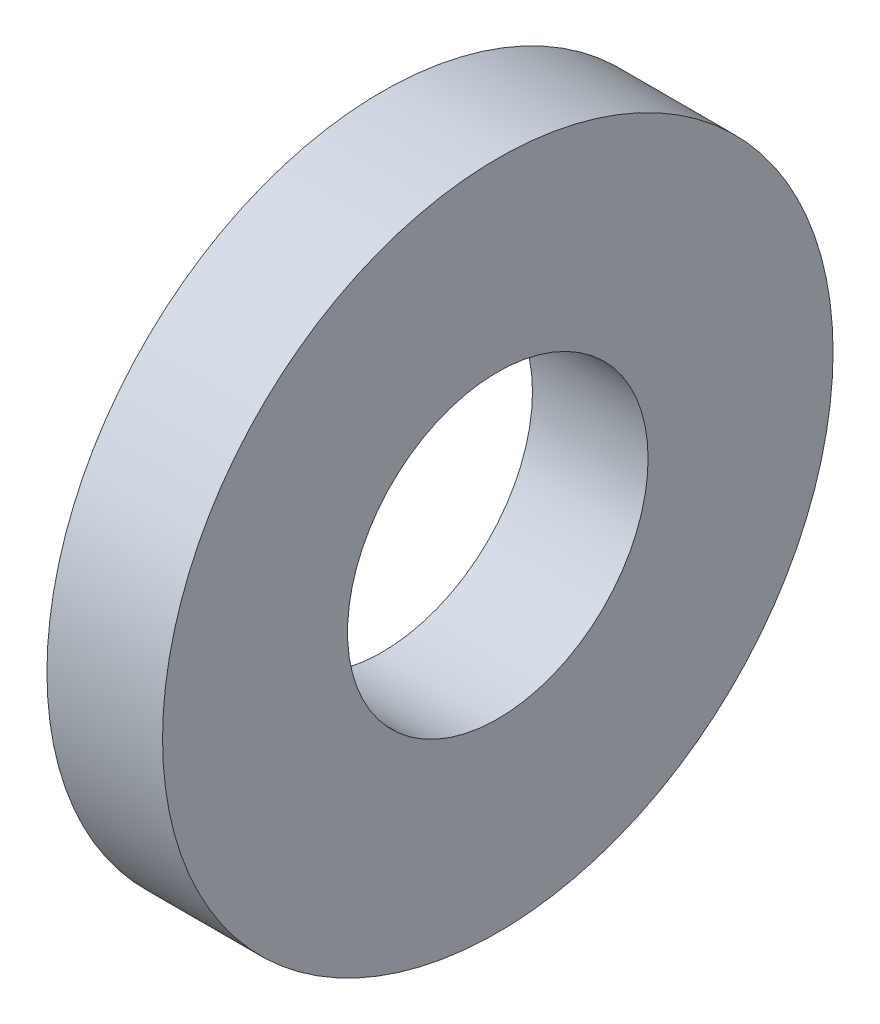
ISO-10303-21;
HEADER;
FILE_DESCRIPTION(('STEP AP214'),'2;1');
FILE_NAME('part.step','',(''),(''),'','','');
FILE_SCHEMA(('AUTOMOTIVE_DESIGN { 1 0 10303 214 1 1 1 1 }'));
ENDSEC;
DATA;
#1=APPLICATION_CONTEXT('core data for automotive mechanical design processes');
#2=APPLICATION_PROTOCOL_DEFINITION('international standard','automotive_design',2000,#1);
#3=PRODUCT_CONTEXT('',#1,'mechanical');
#4=PRODUCT('Part','Part','',(#3));
#5=PRODUCT_RELATED_PRODUCT_CATEGORY('part','',(#4));
#6=PRODUCT_DEFINITION_FORMATION('','',#4);
#7=PRODUCT_DEFINITION_CONTEXT('part definition',#1,'design');
#8=PRODUCT_DEFINITION('design','',#6,#7);
#9=PRODUCT_DEFINITION_SHAPE('','',#8);
#10=(LENGTH_UNIT() NAMED_UNIT(*) SI_UNIT(.MILLI.,.METRE.));
#11=(NAMED_UNIT(*) PLANE_ANGLE_UNIT() SI_UNIT($,.RADIAN.));
#12=(NAMED_UNIT(*) SI_UNIT($,.STERADIAN.) SOLID_ANGLE_UNIT());
#13=UNCERTAINTY_MEASURE_WITH_UNIT(LENGTH_MEASURE(1.E-05),#10,'distance_accuracy_value','');
#14=(GEOMETRIC_REPRESENTATION_CONTEXT(3) GLOBAL_UNCERTAINTY_ASSIGNED_CONTEXT((#13)) GLOBAL_UNIT_ASSIGNED_CONTEXT((#10,
#11,#12)) REPRESENTATION_CONTEXT('',''));
#15=CARTESIAN_POINT('',(0.,0.,0.));
#16=DIRECTION('',(0.,0.,1.));
#17=DIRECTION('',(1.,0.,0.));
#18=AXIS2_PLACEMENT_3D('',#15,#16,#17);
#19=CARTESIAN_POINT('',(1.25,0.,0.));
#20=DIRECTION('',(1.,0.,0.));
#21=DIRECTION('',(0.,0.,-1.));
#22=AXIS2_PLACEMENT_3D('',#19,#20,#21);
#23=PLANE('',#22);
#24=CARTESIAN_POINT('',(1.25,0.,0.));
#25=DIRECTION('',(1.,0.,0.));
#26=DIRECTION('',(0.,0.,-1.));
#27=AXIS2_PLACEMENT_3D('',#24,#25,#26);
#28=CIRCLE('',#27,7.25);
#29=CARTESIAN_POINT('',(1.25,0.,-7.25));
#30=VERTEX_POINT('',#29);
#31=EDGE_CURVE('E10',#30,#30,#28,.T.);
#32=ORIENTED_EDGE('',*,*,#31,.T.);
#33=EDGE_LOOP('',(#32));
#34=FACE_BOUND('',#33,.T.);
#35=CARTESIAN_POINT('',(1.25,0.,0.));
#36=DIRECTION('',(1.,0.,0.));
#37=DIRECTION('',(0.,0.,-1.));
#38=AXIS2_PLACEMENT_3D('',#35,#36,#37);
#39=CIRCLE('',#38,3.25);
#40=CARTESIAN_POINT('',(1.25,0.,-3.25));
#41=VERTEX_POINT('',#40);
#42=EDGE_CURVE('E42',#41,#41,#39,.T.);
#43=ORIENTED_EDGE('',*,*,#42,.F.);
#44=EDGE_LOOP('',(#43));
#45=FACE_BOUND('',#44,.T.);
#46=ADVANCED_FACE('F31',(#34,#45),#23,.T.);
#47=CARTESIAN_POINT('',(-1.25,0.,0.));
#48=DIRECTION('',(1.,0.,0.));
#49=DIRECTION('',(0.,0.,-1.));
#50=AXIS2_PLACEMENT_3D('',#47,#48,#49);
#51=PLANE('',#50);
#52=CARTESIAN_POINT('',(-1.25,0.,0.));
#53=DIRECTION('',(1.,0.,0.));
#54=DIRECTION('',(0.,0.,-1.));
#55=AXIS2_PLACEMENT_3D('',#52,#53,#54);
#56=CIRCLE('',#55,7.25);
#57=CARTESIAN_POINT('',(-1.25,0.,-7.25));
#58=VERTEX_POINT('',#57);
#59=EDGE_CURVE('E35',#58,#58,#56,.T.);
#60=ORIENTED_EDGE('',*,*,#59,.F.);
#61=EDGE_LOOP('',(#60));
#62=FACE_BOUND('',#61,.T.);
#63=CARTESIAN_POINT('',(-1.25,0.,0.));
#64=DIRECTION('',(1.,0.,0.));
#65=DIRECTION('',(0.,0.,-1.));
#66=AXIS2_PLACEMENT_3D('',#63,#64,#65);
#67=CIRCLE('',#66,3.25);
#68=CARTESIAN_POINT('',(-1.25,0.,-3.25));
#69=VERTEX_POINT('',#68);
#70=EDGE_CURVE('E44',#69,#69,#67,.T.);
#71=ORIENTED_EDGE('',*,*,#70,.T.);
#72=EDGE_LOOP('',(#71));
#73=FACE_BOUND('',#72,.T.);
#74=ADVANCED_FACE('F54',(#62,#73),#51,.F.);
#75=CARTESIAN_POINT('',(1.25,0.,0.));
#76=DIRECTION('',(-1.,0.,0.));
#77=DIRECTION('',(0.,0.,1.));
#78=AXIS2_PLACEMENT_3D('',#75,#76,#77);
#79=CYLINDRICAL_SURFACE('',#78,7.25);
#80=ORIENTED_EDGE('',*,*,#31,.F.);
#81=EDGE_LOOP('',(#80));
#82=FACE_BOUND('',#81,.T.);
#83=ORIENTED_EDGE('',*,*,#59,.T.);
#84=EDGE_LOOP('',(#83));
#85=FACE_BOUND('',#84,.T.);
#86=ADVANCED_FACE('F33',(#82,#85),#79,.T.);
#87=CARTESIAN_POINT('',(1.25,0.,0.));
#88=DIRECTION('',(-1.,0.,0.));
#89=DIRECTION('',(0.,0.,1.));
#90=AXIS2_PLACEMENT_3D('',#87,#88,#89);
#91=CYLINDRICAL_SURFACE('',#90,3.25);
#92=ORIENTED_EDGE('',*,*,#42,.T.);
#93=EDGE_LOOP('',(#92));
#94=FACE_BOUND('',#93,.T.);
#95=ORIENTED_EDGE('',*,*,#70,.F.);
#96=EDGE_LOOP('',(#95));
#97=FACE_BOUND('',#96,.T.);
#98=ADVANCED_FACE('F50',(#94,#97),#91,.F.);
#99=CLOSED_SHELL('',(#46,#74,#86,#98));
#100=MANIFOLD_SOLID_BREP('B2',#99);
#101=ADVANCED_BREP_SHAPE_REPRESENTATION('',(#18,#100),#14);
#102=SHAPE_DEFINITION_REPRESENTATION(#9,#101);
ENDSEC;
END-ISO-10303-21;
